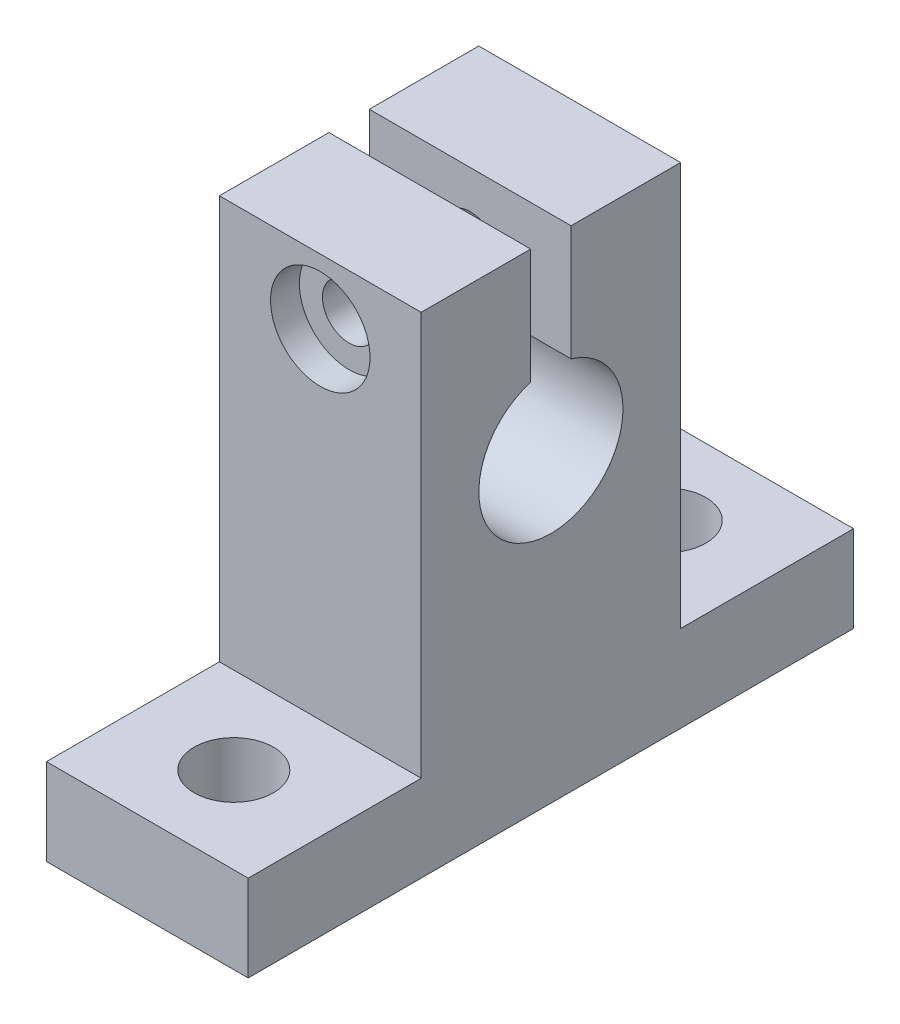
ISO-10303-21;
HEADER;
FILE_DESCRIPTION(('STEP AP214'),'2;1');
FILE_NAME('part.step','',(''),(''),'','','');
FILE_SCHEMA(('AUTOMOTIVE_DESIGN { 1 0 10303 214 1 1 1 1 }'));
ENDSEC;
DATA;
#1=APPLICATION_CONTEXT('core data for automotive mechanical design processes');
#2=APPLICATION_PROTOCOL_DEFINITION('international standard','automotive_design',2000,#1);
#3=PRODUCT_CONTEXT('',#1,'mechanical');
#4=PRODUCT('Part','Part','',(#3));
#5=PRODUCT_RELATED_PRODUCT_CATEGORY('part','',(#4));
#6=PRODUCT_DEFINITION_FORMATION('','',#4);
#7=PRODUCT_DEFINITION_CONTEXT('part definition',#1,'design');
#8=PRODUCT_DEFINITION('design','',#6,#7);
#9=PRODUCT_DEFINITION_SHAPE('','',#8);
#10=(LENGTH_UNIT() NAMED_UNIT(*) SI_UNIT(.MILLI.,.METRE.));
#11=(NAMED_UNIT(*) PLANE_ANGLE_UNIT() SI_UNIT($,.RADIAN.));
#12=(NAMED_UNIT(*) SI_UNIT($,.STERADIAN.) SOLID_ANGLE_UNIT());
#13=UNCERTAINTY_MEASURE_WITH_UNIT(LENGTH_MEASURE(1.E-05),#10,'distance_accuracy_value','');
#14=(GEOMETRIC_REPRESENTATION_CONTEXT(3) GLOBAL_UNCERTAINTY_ASSIGNED_CONTEXT((#13)) GLOBAL_UNIT_ASSIGNED_CONTEXT((#10,
#11,#12)) REPRESENTATION_CONTEXT('',''));
#15=CARTESIAN_POINT('',(0.,0.,0.));
#16=DIRECTION('',(0.,0.,1.));
#17=DIRECTION('',(1.,0.,0.));
#18=AXIS2_PLACEMENT_3D('',#15,#16,#17);
#19=CARTESIAN_POINT('',(7.,29.5,0.));
#20=DIRECTION('',(0.,0.,-1.));
#21=DIRECTION('',(-1.,0.,0.));
#22=AXIS2_PLACEMENT_3D('',#19,#20,#21);
#23=CYLINDRICAL_SURFACE('',#22,1.85);
#24=CARTESIAN_POINT('',(7.,29.5,-19.6));
#25=DIRECTION('',(0.,0.,1.));
#26=DIRECTION('',(1.,0.,0.));
#27=AXIS2_PLACEMENT_3D('',#24,#25,#26);
#28=CIRCLE('',#27,1.85);
#29=CARTESIAN_POINT('',(5.15,29.5,-19.6));
#30=VERTEX_POINT('',#29);
#31=EDGE_CURVE('E293',#30,#30,#28,.T.);
#32=CARTESIAN_POINT('',(7.,29.5,-14.));
#33=DIRECTION('',(0.,0.,1.));
#34=DIRECTION('',(1.,0.,0.));
#35=AXIS2_PLACEMENT_3D('',#32,#33,#34);
#36=CIRCLE('',#35,1.85);
#37=CARTESIAN_POINT('',(5.15,29.5,-14.));
#38=VERTEX_POINT('',#37);
#39=EDGE_CURVE('E44',#38,#38,#36,.F.);
#40=CARTESIAN_POINT('',(5.15,29.5,-19.6));
#41=CARTESIAN_POINT('',(5.15,29.5,-19.5416666666667));
#42=CARTESIAN_POINT('',(5.15,29.5,-19.4833333333333));
#43=CARTESIAN_POINT('',(5.15,29.5,-19.3666666666667));
#44=CARTESIAN_POINT('',(5.15,29.5,-19.3083333333333));
#45=CARTESIAN_POINT('',(5.15,29.5,-19.1916666666667));
#46=CARTESIAN_POINT('',(5.15,29.5,-19.1333333333333));
#47=CARTESIAN_POINT('',(5.15,29.5,-19.0166666666667));
#48=CARTESIAN_POINT('',(5.15,29.5,-18.9583333333333));
#49=CARTESIAN_POINT('',(5.15,29.5,-18.8416666666667));
#50=CARTESIAN_POINT('',(5.15,29.5,-18.7833333333333));
#51=CARTESIAN_POINT('',(5.15,29.5,-18.6666666666667));
#52=CARTESIAN_POINT('',(5.15,29.5,-18.6083333333333));
#53=CARTESIAN_POINT('',(5.15,29.5,-18.4916666666667));
#54=CARTESIAN_POINT('',(5.15,29.5,-18.4333333333333));
#55=CARTESIAN_POINT('',(5.15,29.5,-18.3166666666667));
#56=CARTESIAN_POINT('',(5.15,29.5,-18.2583333333333));
#57=CARTESIAN_POINT('',(5.15,29.5,-18.1416666666667));
#58=CARTESIAN_POINT('',(5.15,29.5,-18.0833333333333));
#59=CARTESIAN_POINT('',(5.15,29.5,-17.9666666666667));
#60=CARTESIAN_POINT('',(5.15,29.5,-17.9083333333333));
#61=CARTESIAN_POINT('',(5.15,29.5,-17.7916666666667));
#62=CARTESIAN_POINT('',(5.15,29.5,-17.7333333333333));
#63=CARTESIAN_POINT('',(5.15,29.5,-17.6166666666667));
#64=CARTESIAN_POINT('',(5.15,29.5,-17.5583333333333));
#65=CARTESIAN_POINT('',(5.15,29.5,-17.4416666666667));
#66=CARTESIAN_POINT('',(5.15,29.5,-17.3833333333333));
#67=CARTESIAN_POINT('',(5.15,29.5,-17.2666666666667));
#68=CARTESIAN_POINT('',(5.15,29.5,-17.2083333333333));
#69=CARTESIAN_POINT('',(5.15,29.5,-17.0916666666667));
#70=CARTESIAN_POINT('',(5.15,29.5,-17.0333333333333));
#71=CARTESIAN_POINT('',(5.15,29.5,-16.9166666666667));
#72=CARTESIAN_POINT('',(5.15,29.5,-16.8583333333333));
#73=CARTESIAN_POINT('',(5.15,29.5,-16.7416666666667));
#74=CARTESIAN_POINT('',(5.15,29.5,-16.6833333333333));
#75=CARTESIAN_POINT('',(5.15,29.5,-16.5666666666667));
#76=CARTESIAN_POINT('',(5.15,29.5,-16.5083333333333));
#77=CARTESIAN_POINT('',(5.15,29.5,-16.3916666666667));
#78=CARTESIAN_POINT('',(5.15,29.5,-16.3333333333333));
#79=CARTESIAN_POINT('',(5.15,29.5,-16.2166666666667));
#80=CARTESIAN_POINT('',(5.15,29.5,-16.1583333333333));
#81=CARTESIAN_POINT('',(5.15,29.5,-16.0416666666667));
#82=CARTESIAN_POINT('',(5.15,29.5,-15.9833333333333));
#83=CARTESIAN_POINT('',(5.15,29.5,-15.8666666666667));
#84=CARTESIAN_POINT('',(5.15,29.5,-15.8083333333333));
#85=CARTESIAN_POINT('',(5.15,29.5,-15.6916666666667));
#86=CARTESIAN_POINT('',(5.15,29.5,-15.6333333333333));
#87=CARTESIAN_POINT('',(5.15,29.5,-15.5166666666667));
#88=CARTESIAN_POINT('',(5.15,29.5,-15.4583333333333));
#89=CARTESIAN_POINT('',(5.15,29.5,-15.3416666666667));
#90=CARTESIAN_POINT('',(5.15,29.5,-15.2833333333333));
#91=CARTESIAN_POINT('',(5.15,29.5,-15.1666666666667));
#92=CARTESIAN_POINT('',(5.15,29.5,-15.1083333333333));
#93=CARTESIAN_POINT('',(5.15,29.5,-14.9916666666667));
#94=CARTESIAN_POINT('',(5.15,29.5,-14.9333333333333));
#95=CARTESIAN_POINT('',(5.15,29.5,-14.8166666666667));
#96=CARTESIAN_POINT('',(5.15,29.5,-14.7583333333333));
#97=CARTESIAN_POINT('',(5.15,29.5,-14.6416666666667));
#98=CARTESIAN_POINT('',(5.15,29.5,-14.5833333333333));
#99=CARTESIAN_POINT('',(5.15,29.5,-14.4666666666667));
#100=CARTESIAN_POINT('',(5.15,29.5,-14.4083333333333));
#101=CARTESIAN_POINT('',(5.15,29.5,-14.2916666666667));
#102=CARTESIAN_POINT('',(5.15,29.5,-14.2333333333333));
#103=CARTESIAN_POINT('',(5.15,29.5,-14.1166666666667));
#104=CARTESIAN_POINT('',(5.15,29.5,-14.0583333333333));
#105=CARTESIAN_POINT('',(5.15,29.5,-14.));
#106=B_SPLINE_CURVE_WITH_KNOTS('',3,(#40,#41,#42,#43,#44,#45,#46,#47,#48,#49,#50,#51,#52,#53,
#54,#55,#56,#57,#58,#59,#60,#61,#62,#63,#64,#65,#66,#67,#68,#69,#70,#71,#72,#73,#74,#75,#76,#77,
#78,#79,#80,#81,#82,#83,#84,#85,#86,#87,#88,#89,#90,#91,#92,#93,#94,#95,#96,#97,#98,#99,#100,
#101,#102,#103,#104,#105),.UNSPECIFIED.,.F.,.F.,(4,2,2,2,2,2,2,2,2,2,2,2,2,2,2,2,2,2,2,2,2,2,2,
2,2,2,2,2,2,2,2,2,4),(0.,0.175000000000002,0.35,0.525000000000001,0.699999999999999,
0.875000000000001,1.05,1.225,1.4,1.575,1.75,1.925,2.1,2.275,2.45,2.625,2.8,2.975,3.15,3.325,3.5,
3.675,3.85,4.025,4.2,4.375,4.55,4.725,4.9,5.075,5.25,5.425,5.6),.UNSPECIFIED.);
#107=EDGE_CURVE('BSEAM40',#30,#38,#106,.T.);
#108=ORIENTED_EDGE('',*,*,#31,.F.);
#109=ORIENTED_EDGE('',*,*,#39,.F.);
#110=ORIENTED_EDGE('',*,*,#107,.T.);
#111=ORIENTED_EDGE('',*,*,#107,.F.);
#112=EDGE_LOOP('',(#108,#110,#109,#111));
#113=FACE_BOUND('',#112,.T.);
#114=ADVANCED_FACE('F40',(#113),#23,.F.);
#115=CARTESIAN_POINT('',(14.,0.,0.));
#116=DIRECTION('',(0.,0.,-1.));
#117=DIRECTION('',(-1.,0.,0.));
#118=AXIS2_PLACEMENT_3D('',#115,#116,#117);
#119=PLANE('',#118);
#120=DIRECTION('',(0.,-1.,0.));
#121=VECTOR('',#120,1.);
#122=CARTESIAN_POINT('',(0.,0.,0.));
#123=LINE('',#122,#121);
#124=CARTESIAN_POINT('',(0.,6.,0.));
#125=VERTEX_POINT('',#124);
#126=CARTESIAN_POINT('',(0.,0.,0.));
#127=VERTEX_POINT('',#126);
#128=EDGE_CURVE('E162',#125,#127,#123,.T.);
#129=ORIENTED_EDGE('',*,*,#128,.T.);
#130=DIRECTION('',(-1.,0.,0.));
#131=VECTOR('',#130,1.);
#132=CARTESIAN_POINT('',(14.,0.,0.));
#133=LINE('',#132,#131);
#134=CARTESIAN_POINT('',(14.,0.,0.));
#135=VERTEX_POINT('',#134);
#136=EDGE_CURVE('E11',#135,#127,#133,.T.);
#137=ORIENTED_EDGE('',*,*,#136,.F.);
#138=DIRECTION('',(0.,-1.,0.));
#139=VECTOR('',#138,1.);
#140=CARTESIAN_POINT('',(14.,0.,0.));
#141=LINE('',#140,#139);
#142=CARTESIAN_POINT('',(14.,6.,0.));
#143=VERTEX_POINT('',#142);
#144=EDGE_CURVE('E185',#143,#135,#141,.T.);
#145=ORIENTED_EDGE('',*,*,#144,.F.);
#146=DIRECTION('',(-1.,0.,0.));
#147=VECTOR('',#146,1.);
#148=CARTESIAN_POINT('',(14.,6.,0.));
#149=LINE('',#148,#147);
#150=EDGE_CURVE('E158',#143,#125,#149,.T.);
#151=ORIENTED_EDGE('',*,*,#150,.T.);
#152=EDGE_LOOP('',(#129,#137,#145,#151));
#153=FACE_BOUND('',#152,.T.);
#154=ADVANCED_FACE('F42',(#153),#119,.F.);
#155=CARTESIAN_POINT('',(14.,0.,0.));
#156=DIRECTION('',(0.,1.,0.));
#157=DIRECTION('',(0.,0.,1.));
#158=AXIS2_PLACEMENT_3D('',#155,#156,#157);
#159=PLANE('',#158);
#160=CARTESIAN_POINT('',(7.,0.,-36.));
#161=DIRECTION('',(0.,1.,0.));
#162=DIRECTION('',(0.,0.,1.));
#163=AXIS2_PLACEMENT_3D('',#160,#161,#162);
#164=CIRCLE('',#163,2.75);
#165=CARTESIAN_POINT('',(7.,0.,-33.25));
#166=VERTEX_POINT('',#165);
#167=EDGE_CURVE('E301',#166,#166,#164,.T.);
#168=ORIENTED_EDGE('',*,*,#167,.T.);
#169=EDGE_LOOP('',(#168));
#170=FACE_BOUND('',#169,.T.);
#171=CARTESIAN_POINT('',(7.,0.,-6.));
#172=DIRECTION('',(0.,1.,0.));
#173=DIRECTION('',(0.,0.,1.));
#174=AXIS2_PLACEMENT_3D('',#171,#172,#173);
#175=CIRCLE('',#174,2.75);
#176=CARTESIAN_POINT('',(7.,0.,-3.25));
#177=VERTEX_POINT('',#176);
#178=EDGE_CURVE('E302',#177,#177,#175,.T.);
#179=ORIENTED_EDGE('',*,*,#178,.T.);
#180=EDGE_LOOP('',(#179));
#181=FACE_BOUND('',#180,.T.);
#182=DIRECTION('',(0.,0.,-1.));
#183=VECTOR('',#182,1.);
#184=CARTESIAN_POINT('',(0.,0.,0.));
#185=LINE('',#184,#183);
#186=CARTESIAN_POINT('',(0.,0.,-42.));
#187=VERTEX_POINT('',#186);
#188=EDGE_CURVE('E165',#127,#187,#185,.T.);
#189=ORIENTED_EDGE('',*,*,#188,.T.);
#190=DIRECTION('',(-1.,0.,0.));
#191=VECTOR('',#190,1.);
#192=CARTESIAN_POINT('',(14.,0.,-42.));
#193=LINE('',#192,#191);
#194=CARTESIAN_POINT('',(14.,0.,-42.));
#195=VERTEX_POINT('',#194);
#196=EDGE_CURVE('E50',#195,#187,#193,.T.);
#197=ORIENTED_EDGE('',*,*,#196,.F.);
#198=DIRECTION('',(0.,0.,-1.));
#199=VECTOR('',#198,1.);
#200=CARTESIAN_POINT('',(14.,0.,0.));
#201=LINE('',#200,#199);
#202=EDGE_CURVE('E113',#135,#195,#201,.T.);
#203=ORIENTED_EDGE('',*,*,#202,.F.);
#204=ORIENTED_EDGE('',*,*,#136,.T.);
#205=EDGE_LOOP('',(#189,#197,#203,#204));
#206=FACE_BOUND('',#205,.T.);
#207=ADVANCED_FACE('F273',(#170,#181,#206),#159,.F.);
#208=CARTESIAN_POINT('',(14.,0.,-42.));
#209=DIRECTION('',(0.,0.,1.));
#210=DIRECTION('',(1.,0.,0.));
#211=AXIS2_PLACEMENT_3D('',#208,#209,#210);
#212=PLANE('',#211);
#213=DIRECTION('',(0.,1.,0.));
#214=VECTOR('',#213,1.);
#215=CARTESIAN_POINT('',(0.,0.,-42.));
#216=LINE('',#215,#214);
#217=CARTESIAN_POINT('',(0.,6.,-42.));
#218=VERTEX_POINT('',#217);
#219=EDGE_CURVE('E168',#187,#218,#216,.T.);
#220=ORIENTED_EDGE('',*,*,#219,.T.);
#221=DIRECTION('',(-1.,0.,0.));
#222=VECTOR('',#221,1.);
#223=CARTESIAN_POINT('',(14.,6.,-42.));
#224=LINE('',#223,#222);
#225=CARTESIAN_POINT('',(14.,6.,-42.));
#226=VERTEX_POINT('',#225);
#227=EDGE_CURVE('E204',#226,#218,#224,.T.);
#228=ORIENTED_EDGE('',*,*,#227,.F.);
#229=DIRECTION('',(0.,1.,0.));
#230=VECTOR('',#229,1.);
#231=CARTESIAN_POINT('',(14.,0.,-42.));
#232=LINE('',#231,#230);
#233=EDGE_CURVE('E213',#195,#226,#232,.T.);
#234=ORIENTED_EDGE('',*,*,#233,.F.);
#235=ORIENTED_EDGE('',*,*,#196,.T.);
#236=EDGE_LOOP('',(#220,#228,#234,#235));
#237=FACE_BOUND('',#236,.T.);
#238=ADVANCED_FACE('F211',(#237),#212,.F.);
#239=CARTESIAN_POINT('',(14.,6.,-42.));
#240=DIRECTION('',(0.,-1.,0.));
#241=DIRECTION('',(0.,0.,-1.));
#242=AXIS2_PLACEMENT_3D('',#239,#240,#241);
#243=PLANE('',#242);
#244=CARTESIAN_POINT('',(7.,6.,-36.));
#245=DIRECTION('',(0.,1.,0.));
#246=DIRECTION('',(0.,0.,1.));
#247=AXIS2_PLACEMENT_3D('',#244,#245,#246);
#248=CIRCLE('',#247,2.75);
#249=CARTESIAN_POINT('',(7.,6.,-33.25));
#250=VERTEX_POINT('',#249);
#251=EDGE_CURVE('E308',#250,#250,#248,.T.);
#252=ORIENTED_EDGE('',*,*,#251,.F.);
#253=EDGE_LOOP('',(#252));
#254=FACE_BOUND('',#253,.T.);
#255=DIRECTION('',(0.,0.,1.));
#256=VECTOR('',#255,1.);
#257=CARTESIAN_POINT('',(0.,6.,-42.));
#258=LINE('',#257,#256);
#259=CARTESIAN_POINT('',(0.,6.,-30.));
#260=VERTEX_POINT('',#259);
#261=EDGE_CURVE('E170',#218,#260,#258,.T.);
#262=ORIENTED_EDGE('',*,*,#261,.T.);
#263=DIRECTION('',(-1.,0.,0.));
#264=VECTOR('',#263,1.);
#265=CARTESIAN_POINT('',(14.,6.,-30.));
#266=LINE('',#265,#264);
#267=CARTESIAN_POINT('',(14.,6.,-30.));
#268=VERTEX_POINT('',#267);
#269=EDGE_CURVE('E201',#268,#260,#266,.T.);
#270=ORIENTED_EDGE('',*,*,#269,.F.);
#271=DIRECTION('',(0.,0.,1.));
#272=VECTOR('',#271,1.);
#273=CARTESIAN_POINT('',(14.,6.,-42.));
#274=LINE('',#273,#272);
#275=EDGE_CURVE('E231',#226,#268,#274,.T.);
#276=ORIENTED_EDGE('',*,*,#275,.F.);
#277=ORIENTED_EDGE('',*,*,#227,.T.);
#278=EDGE_LOOP('',(#262,#270,#276,#277));
#279=FACE_BOUND('',#278,.T.);
#280=ADVANCED_FACE('F222',(#254,#279),#243,.F.);
#281=CARTESIAN_POINT('',(14.,6.,-30.));
#282=DIRECTION('',(0.,0.,1.));
#283=DIRECTION('',(1.,0.,0.));
#284=AXIS2_PLACEMENT_3D('',#281,#282,#283);
#285=PLANE('',#284);
#286=CARTESIAN_POINT('',(7.,29.5,-30.));
#287=DIRECTION('',(0.,0.,-1.));
#288=DIRECTION('',(-1.,0.,0.));
#289=AXIS2_PLACEMENT_3D('',#286,#287,#288);
#290=CIRCLE('',#289,1.85);
#291=CARTESIAN_POINT('',(5.15,29.5,-30.));
#292=VERTEX_POINT('',#291);
#293=EDGE_CURVE('E289',#292,#292,#290,.T.);
#294=ORIENTED_EDGE('',*,*,#293,.F.);
#295=EDGE_LOOP('',(#294));
#296=FACE_BOUND('',#295,.T.);
#297=DIRECTION('',(0.,1.,0.));
#298=VECTOR('',#297,1.);
#299=CARTESIAN_POINT('',(0.,6.,-30.));
#300=LINE('',#299,#298);
#301=CARTESIAN_POINT('',(0.,34.,-30.));
#302=VERTEX_POINT('',#301);
#303=EDGE_CURVE('E172',#260,#302,#300,.T.);
#304=ORIENTED_EDGE('',*,*,#303,.T.);
#305=DIRECTION('',(-1.,0.,0.));
#306=VECTOR('',#305,1.);
#307=CARTESIAN_POINT('',(14.,34.,-30.));
#308=LINE('',#307,#306);
#309=CARTESIAN_POINT('',(14.,34.,-30.));
#310=VERTEX_POINT('',#309);
#311=EDGE_CURVE('E198',#310,#302,#308,.T.);
#312=ORIENTED_EDGE('',*,*,#311,.F.);
#313=DIRECTION('',(0.,1.,0.));
#314=VECTOR('',#313,1.);
#315=CARTESIAN_POINT('',(14.,6.,-30.));
#316=LINE('',#315,#314);
#317=EDGE_CURVE('E228',#268,#310,#316,.T.);
#318=ORIENTED_EDGE('',*,*,#317,.F.);
#319=ORIENTED_EDGE('',*,*,#269,.T.);
#320=EDGE_LOOP('',(#304,#312,#318,#319));
#321=FACE_BOUND('',#320,.T.);
#322=ADVANCED_FACE('F226',(#296,#321),#285,.F.);
#323=CARTESIAN_POINT('',(14.,34.,-30.));
#324=DIRECTION('',(0.,-1.,0.));
#325=DIRECTION('',(0.,0.,-1.));
#326=AXIS2_PLACEMENT_3D('',#323,#324,#325);
#327=PLANE('',#326);
#328=DIRECTION('',(0.,0.,1.));
#329=VECTOR('',#328,1.);
#330=CARTESIAN_POINT('',(0.,34.,-30.));
#331=LINE('',#330,#329);
#332=CARTESIAN_POINT('',(0.,34.,-22.4));
#333=VERTEX_POINT('',#332);
#334=EDGE_CURVE('E174',#302,#333,#331,.T.);
#335=ORIENTED_EDGE('',*,*,#334,.T.);
#336=DIRECTION('',(-1.,0.,0.));
#337=VECTOR('',#336,1.);
#338=CARTESIAN_POINT('',(14.,34.,-22.4));
#339=LINE('',#338,#337);
#340=CARTESIAN_POINT('',(14.,34.,-22.4));
#341=VERTEX_POINT('',#340);
#342=EDGE_CURVE('E195',#341,#333,#339,.T.);
#343=ORIENTED_EDGE('',*,*,#342,.F.);
#344=DIRECTION('',(0.,0.,1.));
#345=VECTOR('',#344,1.);
#346=CARTESIAN_POINT('',(14.,34.,-30.));
#347=LINE('',#346,#345);
#348=EDGE_CURVE('E230',#310,#341,#347,.T.);
#349=ORIENTED_EDGE('',*,*,#348,.F.);
#350=ORIENTED_EDGE('',*,*,#311,.T.);
#351=EDGE_LOOP('',(#335,#343,#349,#350));
#352=FACE_BOUND('',#351,.T.);
#353=ADVANCED_FACE('F347',(#352),#327,.F.);
#354=CARTESIAN_POINT('',(14.,34.,-22.4));
#355=DIRECTION('',(0.,0.,-1.));
#356=DIRECTION('',(-1.,0.,0.));
#357=AXIS2_PLACEMENT_3D('',#354,#355,#356);
#358=PLANE('',#357);
#359=CARTESIAN_POINT('',(7.,29.5,-22.4));
#360=DIRECTION('',(0.,0.,-1.));
#361=DIRECTION('',(-1.,0.,0.));
#362=AXIS2_PLACEMENT_3D('',#359,#360,#361);
#363=CIRCLE('',#362,1.85);
#364=CARTESIAN_POINT('',(5.15,29.5,-22.4));
#365=VERTEX_POINT('',#364);
#366=EDGE_CURVE('E166',#365,#365,#363,.T.);
#367=ORIENTED_EDGE('',*,*,#366,.T.);
#368=EDGE_LOOP('',(#367));
#369=FACE_BOUND('',#368,.T.);
#370=DIRECTION('',(0.,-1.,0.));
#371=VECTOR('',#370,1.);
#372=CARTESIAN_POINT('',(0.,34.,-22.4));
#373=LINE('',#372,#371);
#374=CARTESIAN_POINT('',(0.,26.,-22.4));
#375=VERTEX_POINT('',#374);
#376=EDGE_CURVE('E176',#333,#375,#373,.T.);
#377=ORIENTED_EDGE('',*,*,#376,.T.);
#378=DIRECTION('',(-1.,0.,0.));
#379=VECTOR('',#378,1.);
#380=CARTESIAN_POINT('',(14.,26.,-22.4));
#381=LINE('',#380,#379);
#382=CARTESIAN_POINT('',(14.,26.,-22.4));
#383=VERTEX_POINT('',#382);
#384=EDGE_CURVE('E192',#383,#375,#381,.T.);
#385=ORIENTED_EDGE('',*,*,#384,.F.);
#386=DIRECTION('',(0.,-1.,0.));
#387=VECTOR('',#386,1.);
#388=CARTESIAN_POINT('',(14.,34.,-22.4));
#389=LINE('',#388,#387);
#390=EDGE_CURVE('E233',#341,#383,#389,.T.);
#391=ORIENTED_EDGE('',*,*,#390,.F.);
#392=ORIENTED_EDGE('',*,*,#342,.T.);
#393=EDGE_LOOP('',(#377,#385,#391,#392));
#394=FACE_BOUND('',#393,.T.);
#395=ADVANCED_FACE('F378',(#369,#394),#358,.F.);
#396=CARTESIAN_POINT('',(14.,21.2,-21.));
#397=DIRECTION('',(-1.,0.,0.));
#398=DIRECTION('',(0.,0.,1.));
#399=AXIS2_PLACEMENT_3D('',#396,#397,#398);
#400=CYLINDRICAL_SURFACE('',#399,5.);
#401=CARTESIAN_POINT('',(0.,21.2,-21.));
#402=DIRECTION('',(-1.,0.,0.));
#403=DIRECTION('',(0.,0.,-1.));
#404=AXIS2_PLACEMENT_3D('',#401,#402,#403);
#405=CIRCLE('',#404,5.);
#406=CARTESIAN_POINT('',(0.,26.,-19.6));
#407=VERTEX_POINT('',#406);
#408=EDGE_CURVE('E178',#375,#407,#405,.T.);
#409=ORIENTED_EDGE('',*,*,#408,.T.);
#410=DIRECTION('',(-1.,0.,0.));
#411=VECTOR('',#410,1.);
#412=CARTESIAN_POINT('',(14.,26.,-19.6));
#413=LINE('',#412,#411);
#414=CARTESIAN_POINT('',(14.,26.,-19.6));
#415=VERTEX_POINT('',#414);
#416=EDGE_CURVE('E189',#415,#407,#413,.T.);
#417=ORIENTED_EDGE('',*,*,#416,.F.);
#418=CARTESIAN_POINT('',(14.,21.2,-21.));
#419=DIRECTION('',(-1.,0.,0.));
#420=DIRECTION('',(0.,0.,-1.));
#421=AXIS2_PLACEMENT_3D('',#418,#419,#420);
#422=CIRCLE('',#421,5.);
#423=EDGE_CURVE('E239',#383,#415,#422,.T.);
#424=ORIENTED_EDGE('',*,*,#423,.F.);
#425=ORIENTED_EDGE('',*,*,#384,.T.);
#426=EDGE_LOOP('',(#409,#417,#424,#425));
#427=FACE_BOUND('',#426,.T.);
#428=ADVANCED_FACE('F245',(#427),#400,.F.);
#429=CARTESIAN_POINT('',(14.,34.,-19.6));
#430=DIRECTION('',(0.,0.,1.));
#431=DIRECTION('',(1.,0.,0.));
#432=AXIS2_PLACEMENT_3D('',#429,#430,#431);
#433=PLANE('',#432);
#434=ORIENTED_EDGE('',*,*,#31,.T.);
#435=EDGE_LOOP('',(#434));
#436=FACE_BOUND('',#435,.T.);
#437=DIRECTION('',(0.,1.,0.));
#438=VECTOR('',#437,1.);
#439=CARTESIAN_POINT('',(0.,34.,-19.6));
#440=LINE('',#439,#438);
#441=CARTESIAN_POINT('',(0.,34.,-19.6));
#442=VERTEX_POINT('',#441);
#443=EDGE_CURVE('E180',#407,#442,#440,.T.);
#444=ORIENTED_EDGE('',*,*,#443,.T.);
#445=DIRECTION('',(-1.,0.,0.));
#446=VECTOR('',#445,1.);
#447=CARTESIAN_POINT('',(14.,34.,-19.6));
#448=LINE('',#447,#446);
#449=CARTESIAN_POINT('',(14.,34.,-19.6));
#450=VERTEX_POINT('',#449);
#451=EDGE_CURVE('E153',#450,#442,#448,.T.);
#452=ORIENTED_EDGE('',*,*,#451,.F.);
#453=DIRECTION('',(0.,1.,0.));
#454=VECTOR('',#453,1.);
#455=CARTESIAN_POINT('',(14.,34.,-19.6));
#456=LINE('',#455,#454);
#457=EDGE_CURVE('E144',#415,#450,#456,.T.);
#458=ORIENTED_EDGE('',*,*,#457,.F.);
#459=ORIENTED_EDGE('',*,*,#416,.T.);
#460=EDGE_LOOP('',(#444,#452,#458,#459));
#461=FACE_BOUND('',#460,.T.);
#462=ADVANCED_FACE('F249',(#436,#461),#433,.F.);
#463=CARTESIAN_POINT('',(14.,34.,-12.));
#464=DIRECTION('',(0.,-1.,0.));
#465=DIRECTION('',(0.,0.,-1.));
#466=AXIS2_PLACEMENT_3D('',#463,#464,#465);
#467=PLANE('',#466);
#468=DIRECTION('',(0.,0.,1.));
#469=VECTOR('',#468,1.);
#470=CARTESIAN_POINT('',(0.,34.,-12.));
#471=LINE('',#470,#469);
#472=CARTESIAN_POINT('',(0.,34.,-12.));
#473=VERTEX_POINT('',#472);
#474=EDGE_CURVE('E152',#442,#473,#471,.T.);
#475=ORIENTED_EDGE('',*,*,#474,.T.);
#476=DIRECTION('',(-1.,0.,0.));
#477=VECTOR('',#476,1.);
#478=CARTESIAN_POINT('',(14.,34.,-12.));
#479=LINE('',#478,#477);
#480=CARTESIAN_POINT('',(14.,34.,-12.));
#481=VERTEX_POINT('',#480);
#482=EDGE_CURVE('E149',#481,#473,#479,.T.);
#483=ORIENTED_EDGE('',*,*,#482,.F.);
#484=DIRECTION('',(0.,0.,1.));
#485=VECTOR('',#484,1.);
#486=CARTESIAN_POINT('',(14.,34.,-12.));
#487=LINE('',#486,#485);
#488=EDGE_CURVE('E138',#450,#481,#487,.T.);
#489=ORIENTED_EDGE('',*,*,#488,.F.);
#490=ORIENTED_EDGE('',*,*,#451,.T.);
#491=EDGE_LOOP('',(#475,#483,#489,#490));
#492=FACE_BOUND('',#491,.T.);
#493=ADVANCED_FACE('F150',(#492),#467,.F.);
#494=CARTESIAN_POINT('',(14.,6.,-12.));
#495=DIRECTION('',(0.,0.,-1.));
#496=DIRECTION('',(-1.,0.,0.));
#497=AXIS2_PLACEMENT_3D('',#494,#495,#496);
#498=PLANE('',#497);
#499=CARTESIAN_POINT('',(7.,29.5,-12.));
#500=DIRECTION('',(0.,0.,1.));
#501=DIRECTION('',(1.,0.,0.));
#502=AXIS2_PLACEMENT_3D('',#499,#500,#501);
#503=CIRCLE('',#502,3.45252247866765);
#504=CARTESIAN_POINT('',(10.4525224786677,29.5,-12.));
#505=VERTEX_POINT('',#504);
#506=EDGE_CURVE('E313',#505,#505,#503,.T.);
#507=ORIENTED_EDGE('',*,*,#506,.F.);
#508=EDGE_LOOP('',(#507));
#509=FACE_BOUND('',#508,.T.);
#510=DIRECTION('',(0.,-1.,0.));
#511=VECTOR('',#510,1.);
#512=CARTESIAN_POINT('',(0.,6.,-12.));
#513=LINE('',#512,#511);
#514=CARTESIAN_POINT('',(0.,6.,-12.));
#515=VERTEX_POINT('',#514);
#516=EDGE_CURVE('E99',#473,#515,#513,.T.);
#517=ORIENTED_EDGE('',*,*,#516,.T.);
#518=DIRECTION('',(-1.,0.,0.));
#519=VECTOR('',#518,1.);
#520=CARTESIAN_POINT('',(14.,6.,-12.));
#521=LINE('',#520,#519);
#522=CARTESIAN_POINT('',(14.,6.,-12.));
#523=VERTEX_POINT('',#522);
#524=EDGE_CURVE('E154',#523,#515,#521,.T.);
#525=ORIENTED_EDGE('',*,*,#524,.F.);
#526=DIRECTION('',(0.,-1.,0.));
#527=VECTOR('',#526,1.);
#528=CARTESIAN_POINT('',(14.,6.,-12.));
#529=LINE('',#528,#527);
#530=EDGE_CURVE('E142',#481,#523,#529,.T.);
#531=ORIENTED_EDGE('',*,*,#530,.F.);
#532=ORIENTED_EDGE('',*,*,#482,.T.);
#533=EDGE_LOOP('',(#517,#525,#531,#532));
#534=FACE_BOUND('',#533,.T.);
#535=ADVANCED_FACE('F156',(#509,#534),#498,.F.);
#536=CARTESIAN_POINT('',(14.,6.,0.));
#537=DIRECTION('',(0.,-1.,0.));
#538=DIRECTION('',(0.,0.,-1.));
#539=AXIS2_PLACEMENT_3D('',#536,#537,#538);
#540=PLANE('',#539);
#541=CARTESIAN_POINT('',(7.,5.99999999999999,-6.));
#542=DIRECTION('',(0.,1.,0.));
#543=DIRECTION('',(0.,0.,1.));
#544=AXIS2_PLACEMENT_3D('',#541,#542,#543);
#545=CIRCLE('',#544,2.75);
#546=CARTESIAN_POINT('',(7.,5.99999999999999,-3.25));
#547=VERTEX_POINT('',#546);
#548=EDGE_CURVE('E305',#547,#547,#545,.T.);
#549=ORIENTED_EDGE('',*,*,#548,.F.);
#550=EDGE_LOOP('',(#549));
#551=FACE_BOUND('',#550,.T.);
#552=DIRECTION('',(0.,0.,1.));
#553=VECTOR('',#552,1.);
#554=CARTESIAN_POINT('',(0.,6.,0.));
#555=LINE('',#554,#553);
#556=EDGE_CURVE('E105',#515,#125,#555,.T.);
#557=ORIENTED_EDGE('',*,*,#556,.T.);
#558=ORIENTED_EDGE('',*,*,#150,.F.);
#559=DIRECTION('',(0.,0.,1.));
#560=VECTOR('',#559,1.);
#561=CARTESIAN_POINT('',(14.,6.,0.));
#562=LINE('',#561,#560);
#563=EDGE_CURVE('E58',#523,#143,#562,.T.);
#564=ORIENTED_EDGE('',*,*,#563,.F.);
#565=ORIENTED_EDGE('',*,*,#524,.T.);
#566=EDGE_LOOP('',(#557,#558,#564,#565));
#567=FACE_BOUND('',#566,.T.);
#568=ADVANCED_FACE('F253',(#551,#567),#540,.F.);
#569=CARTESIAN_POINT('',(14.,21.2,-21.));
#570=DIRECTION('',(1.,0.,0.));
#571=DIRECTION('',(0.,0.,-1.));
#572=AXIS2_PLACEMENT_3D('',#569,#570,#571);
#573=PLANE('',#572);
#574=ORIENTED_EDGE('',*,*,#144,.T.);
#575=ORIENTED_EDGE('',*,*,#202,.T.);
#576=ORIENTED_EDGE('',*,*,#233,.T.);
#577=ORIENTED_EDGE('',*,*,#275,.T.);
#578=ORIENTED_EDGE('',*,*,#317,.T.);
#579=ORIENTED_EDGE('',*,*,#348,.T.);
#580=ORIENTED_EDGE('',*,*,#390,.T.);
#581=ORIENTED_EDGE('',*,*,#423,.T.);
#582=ORIENTED_EDGE('',*,*,#457,.T.);
#583=ORIENTED_EDGE('',*,*,#488,.T.);
#584=ORIENTED_EDGE('',*,*,#530,.T.);
#585=ORIENTED_EDGE('',*,*,#563,.T.);
#586=EDGE_LOOP('',(#574,#575,#576,#577,#578,#579,#580,#581,#582,#583,#584,#585));
#587=FACE_BOUND('',#586,.T.);
#588=ADVANCED_FACE('F140',(#587),#573,.T.);
#589=CARTESIAN_POINT('',(0.,21.2,-21.));
#590=DIRECTION('',(1.,0.,0.));
#591=DIRECTION('',(0.,0.,-1.));
#592=AXIS2_PLACEMENT_3D('',#589,#590,#591);
#593=PLANE('',#592);
#594=ORIENTED_EDGE('',*,*,#128,.F.);
#595=ORIENTED_EDGE('',*,*,#556,.F.);
#596=ORIENTED_EDGE('',*,*,#516,.F.);
#597=ORIENTED_EDGE('',*,*,#474,.F.);
#598=ORIENTED_EDGE('',*,*,#443,.F.);
#599=ORIENTED_EDGE('',*,*,#408,.F.);
#600=ORIENTED_EDGE('',*,*,#376,.F.);
#601=ORIENTED_EDGE('',*,*,#334,.F.);
#602=ORIENTED_EDGE('',*,*,#303,.F.);
#603=ORIENTED_EDGE('',*,*,#261,.F.);
#604=ORIENTED_EDGE('',*,*,#219,.F.);
#605=ORIENTED_EDGE('',*,*,#188,.F.);
#606=EDGE_LOOP('',(#594,#595,#596,#597,#598,#599,#600,#601,#602,#603,#604,#605));
#607=FACE_BOUND('',#606,.T.);
#608=ADVANCED_FACE('F217',(#607),#593,.F.);
#609=CARTESIAN_POINT('',(5.15,29.5,-30.));
#610=CARTESIAN_POINT('',(5.15,29.5,-29.9208333333333));
#611=CARTESIAN_POINT('',(5.15,29.5,-29.8416666666667));
#612=CARTESIAN_POINT('',(5.15,29.5,-29.6833333333333));
#613=CARTESIAN_POINT('',(5.15,29.5,-29.6041666666667));
#614=CARTESIAN_POINT('',(5.15,29.5,-29.4458333333333));
#615=CARTESIAN_POINT('',(5.15,29.5,-29.3666666666667));
#616=CARTESIAN_POINT('',(5.15,29.5,-29.2083333333333));
#617=CARTESIAN_POINT('',(5.15,29.5,-29.1291666666667));
#618=CARTESIAN_POINT('',(5.15,29.5,-28.9708333333333));
#619=CARTESIAN_POINT('',(5.15,29.5,-28.8916666666667));
#620=CARTESIAN_POINT('',(5.15,29.5,-28.7333333333333));
#621=CARTESIAN_POINT('',(5.15,29.5,-28.6541666666667));
#622=CARTESIAN_POINT('',(5.15,29.5,-28.4958333333333));
#623=CARTESIAN_POINT('',(5.15,29.5,-28.4166666666667));
#624=CARTESIAN_POINT('',(5.15,29.5,-28.2583333333333));
#625=CARTESIAN_POINT('',(5.15,29.5,-28.1791666666667));
#626=CARTESIAN_POINT('',(5.15,29.5,-28.0208333333333));
#627=CARTESIAN_POINT('',(5.15,29.5,-27.9416666666667));
#628=CARTESIAN_POINT('',(5.15,29.5,-27.7833333333333));
#629=CARTESIAN_POINT('',(5.15,29.5,-27.7041666666667));
#630=CARTESIAN_POINT('',(5.15,29.5,-27.5458333333333));
#631=CARTESIAN_POINT('',(5.15,29.5,-27.4666666666667));
#632=CARTESIAN_POINT('',(5.15,29.5,-27.3083333333333));
#633=CARTESIAN_POINT('',(5.15,29.5,-27.2291666666667));
#634=CARTESIAN_POINT('',(5.15,29.5,-27.0708333333333));
#635=CARTESIAN_POINT('',(5.15,29.5,-26.9916666666667));
#636=CARTESIAN_POINT('',(5.15,29.5,-26.8333333333333));
#637=CARTESIAN_POINT('',(5.15,29.5,-26.7541666666667));
#638=CARTESIAN_POINT('',(5.15,29.5,-26.5958333333333));
#639=CARTESIAN_POINT('',(5.15,29.5,-26.5166666666667));
#640=CARTESIAN_POINT('',(5.15,29.5,-26.3583333333333));
#641=CARTESIAN_POINT('',(5.15,29.5,-26.2791666666667));
#642=CARTESIAN_POINT('',(5.15,29.5,-26.1208333333333));
#643=CARTESIAN_POINT('',(5.15,29.5,-26.0416666666667));
#644=CARTESIAN_POINT('',(5.15,29.5,-25.8833333333333));
#645=CARTESIAN_POINT('',(5.15,29.5,-25.8041666666667));
#646=CARTESIAN_POINT('',(5.15,29.5,-25.6458333333333));
#647=CARTESIAN_POINT('',(5.15,29.5,-25.5666666666667));
#648=CARTESIAN_POINT('',(5.15,29.5,-25.4083333333333));
#649=CARTESIAN_POINT('',(5.15,29.5,-25.3291666666667));
#650=CARTESIAN_POINT('',(5.15,29.5,-25.1708333333333));
#651=CARTESIAN_POINT('',(5.15,29.5,-25.0916666666667));
#652=CARTESIAN_POINT('',(5.15,29.5,-24.9333333333333));
#653=CARTESIAN_POINT('',(5.15,29.5,-24.8541666666667));
#654=CARTESIAN_POINT('',(5.15,29.5,-24.6958333333333));
#655=CARTESIAN_POINT('',(5.15,29.5,-24.6166666666667));
#656=CARTESIAN_POINT('',(5.15,29.5,-24.4583333333333));
#657=CARTESIAN_POINT('',(5.15,29.5,-24.3791666666667));
#658=CARTESIAN_POINT('',(5.15,29.5,-24.2208333333333));
#659=CARTESIAN_POINT('',(5.15,29.5,-24.1416666666667));
#660=CARTESIAN_POINT('',(5.15,29.5,-23.9833333333333));
#661=CARTESIAN_POINT('',(5.15,29.5,-23.9041666666667));
#662=CARTESIAN_POINT('',(5.15,29.5,-23.7458333333333));
#663=CARTESIAN_POINT('',(5.15,29.5,-23.6666666666667));
#664=CARTESIAN_POINT('',(5.15,29.5,-23.5083333333333));
#665=CARTESIAN_POINT('',(5.15,29.5,-23.4291666666667));
#666=CARTESIAN_POINT('',(5.15,29.5,-23.2708333333333));
#667=CARTESIAN_POINT('',(5.15,29.5,-23.1916666666667));
#668=CARTESIAN_POINT('',(5.15,29.5,-23.0333333333333));
#669=CARTESIAN_POINT('',(5.15,29.5,-22.9541666666667));
#670=CARTESIAN_POINT('',(5.15,29.5,-22.7958333333333));
#671=CARTESIAN_POINT('',(5.15,29.5,-22.7166666666667));
#672=CARTESIAN_POINT('',(5.15,29.5,-22.5583333333333));
#673=CARTESIAN_POINT('',(5.15,29.5,-22.4791666666667));
#674=CARTESIAN_POINT('',(5.15,29.5,-22.4));
#675=B_SPLINE_CURVE_WITH_KNOTS('',3,(#609,#610,#611,#612,#613,#614,#615,#616,#617,#618,#619,
#620,#621,#622,#623,#624,#625,#626,#627,#628,#629,#630,#631,#632,#633,#634,#635,#636,#637,#638,
#639,#640,#641,#642,#643,#644,#645,#646,#647,#648,#649,#650,#651,#652,#653,#654,#655,#656,#657,
#658,#659,#660,#661,#662,#663,#664,#665,#666,#667,#668,#669,#670,#671,#672,#673,#674),
.UNSPECIFIED.,.F.,.F.,(4,2,2,2,2,2,2,2,2,2,2,2,2,2,2,2,2,2,2,2,2,2,2,2,2,2,2,2,2,2,2,2,4),(0.,
0.237500000000002,0.475,0.712500000000001,0.95,1.1875,1.425,1.6625,1.9,2.1375,2.375,2.6125,2.85,
3.0875,3.325,3.5625,3.8,4.0375,4.275,4.5125,4.75,4.9875,5.225,5.4625,5.7,5.9375,6.175,6.4125,
6.65,6.8875,7.125,7.3625,7.6),.UNSPECIFIED.);
#676=EDGE_CURVE('BSEAM269',#292,#365,#675,.T.);
#677=ORIENTED_EDGE('',*,*,#293,.T.);
#678=ORIENTED_EDGE('',*,*,#366,.F.);
#679=ORIENTED_EDGE('',*,*,#676,.T.);
#680=ORIENTED_EDGE('',*,*,#676,.F.);
#681=EDGE_LOOP('',(#677,#679,#678,#680));
#682=FACE_BOUND('',#681,.T.);
#683=ADVANCED_FACE('F269',(#682),#23,.F.);
#684=CARTESIAN_POINT('',(7.,0.,-6.));
#685=DIRECTION('',(0.,1.,0.));
#686=DIRECTION('',(0.,0.,1.));
#687=AXIS2_PLACEMENT_3D('',#684,#685,#686);
#688=CYLINDRICAL_SURFACE('',#687,2.75);
#689=ORIENTED_EDGE('',*,*,#178,.F.);
#690=EDGE_LOOP('',(#689));
#691=FACE_BOUND('',#690,.T.);
#692=ORIENTED_EDGE('',*,*,#548,.T.);
#693=EDGE_LOOP('',(#692));
#694=FACE_BOUND('',#693,.T.);
#695=ADVANCED_FACE('F278',(#691,#694),#688,.F.);
#696=CARTESIAN_POINT('',(7.,0.,-36.));
#697=DIRECTION('',(0.,1.,0.));
#698=DIRECTION('',(0.,0.,1.));
#699=AXIS2_PLACEMENT_3D('',#696,#697,#698);
#700=CYLINDRICAL_SURFACE('',#699,2.75);
#701=ORIENTED_EDGE('',*,*,#167,.F.);
#702=EDGE_LOOP('',(#701));
#703=FACE_BOUND('',#702,.T.);
#704=ORIENTED_EDGE('',*,*,#251,.T.);
#705=EDGE_LOOP('',(#704));
#706=FACE_BOUND('',#705,.T.);
#707=ADVANCED_FACE('F284',(#703,#706),#700,.F.);
#708=CARTESIAN_POINT('',(7.,29.5,-14.));
#709=DIRECTION('',(0.,0.,1.));
#710=DIRECTION('',(1.,0.,0.));
#711=AXIS2_PLACEMENT_3D('',#708,#709,#710);
#712=PLANE('',#711);
#713=CARTESIAN_POINT('',(7.,29.5,-14.));
#714=DIRECTION('',(0.,0.,1.));
#715=DIRECTION('',(1.,0.,0.));
#716=AXIS2_PLACEMENT_3D('',#713,#714,#715);
#717=CIRCLE('',#716,3.45252247866765);
#718=CARTESIAN_POINT('',(10.4525224786677,29.5,-14.));
#719=VERTEX_POINT('',#718);
#720=EDGE_CURVE('E316',#719,#719,#717,.T.);
#721=ORIENTED_EDGE('',*,*,#720,.T.);
#722=EDGE_LOOP('',(#721));
#723=FACE_BOUND('',#722,.T.);
#724=ORIENTED_EDGE('',*,*,#39,.T.);
#725=EDGE_LOOP('',(#724));
#726=FACE_BOUND('',#725,.T.);
#727=ADVANCED_FACE('F323',(#723,#726),#712,.T.);
#728=CARTESIAN_POINT('',(7.,29.5,-14.));
#729=DIRECTION('',(0.,0.,1.));
#730=DIRECTION('',(1.,0.,0.));
#731=AXIS2_PLACEMENT_3D('',#728,#729,#730);
#732=CYLINDRICAL_SURFACE('',#731,3.45252247866765);
#733=ORIENTED_EDGE('',*,*,#720,.F.);
#734=EDGE_LOOP('',(#733));
#735=FACE_BOUND('',#734,.T.);
#736=ORIENTED_EDGE('',*,*,#506,.T.);
#737=EDGE_LOOP('',(#736));
#738=FACE_BOUND('',#737,.T.);
#739=ADVANCED_FACE('F325',(#735,#738),#732,.F.);
#740=CLOSED_SHELL('',(#114,#154,#207,#238,#280,#322,#353,#395,#428,#462,#493,#535,#568,#588,
#608,#683,#695,#707,#727,#739));
#741=MANIFOLD_SOLID_BREP('B2',#740);
#742=ADVANCED_BREP_SHAPE_REPRESENTATION('',(#18,#741),#14);
#743=SHAPE_DEFINITION_REPRESENTATION(#9,#742);
ENDSEC;
END-ISO-10303-21;
